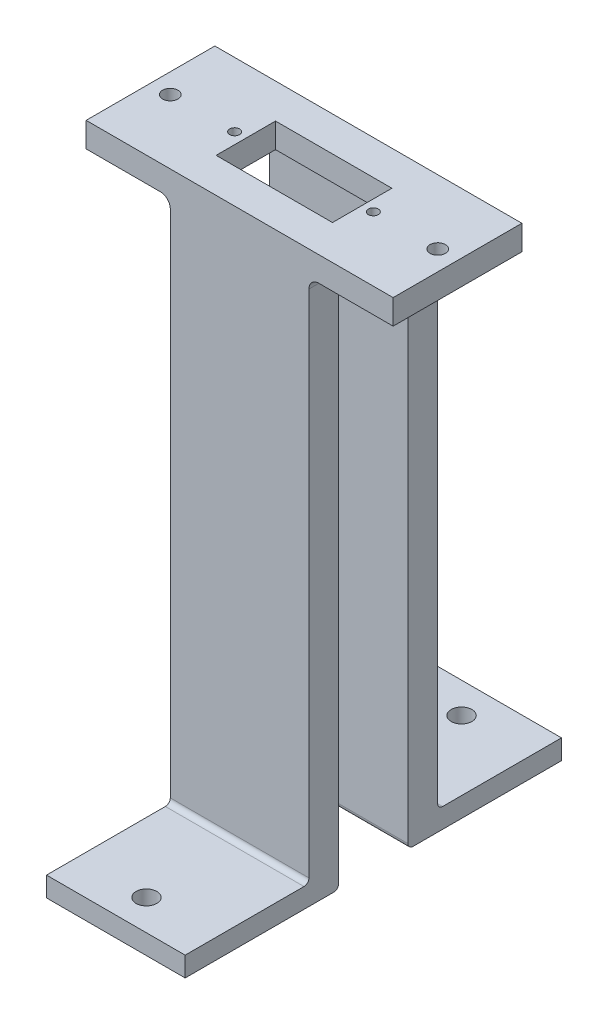
ISO-10303-21;
HEADER;
FILE_DESCRIPTION(('STEP AP214'),'2;1');
FILE_NAME('part.step','',(''),(''),'','','');
FILE_SCHEMA(('AUTOMOTIVE_DESIGN { 1 0 10303 214 1 1 1 1 }'));
ENDSEC;
DATA;
#1=APPLICATION_CONTEXT('core data for automotive mechanical design processes');
#2=APPLICATION_PROTOCOL_DEFINITION('international standard','automotive_design',2000,#1);
#3=PRODUCT_CONTEXT('',#1,'mechanical');
#4=PRODUCT('Part','Part','',(#3));
#5=PRODUCT_RELATED_PRODUCT_CATEGORY('part','',(#4));
#6=PRODUCT_DEFINITION_FORMATION('','',#4);
#7=PRODUCT_DEFINITION_CONTEXT('part definition',#1,'design');
#8=PRODUCT_DEFINITION('design','',#6,#7);
#9=PRODUCT_DEFINITION_SHAPE('','',#8);
#10=(LENGTH_UNIT() NAMED_UNIT(*) SI_UNIT(.MILLI.,.METRE.));
#11=(NAMED_UNIT(*) PLANE_ANGLE_UNIT() SI_UNIT($,.RADIAN.));
#12=(NAMED_UNIT(*) SI_UNIT($,.STERADIAN.) SOLID_ANGLE_UNIT());
#13=UNCERTAINTY_MEASURE_WITH_UNIT(LENGTH_MEASURE(1.E-05),#10,'distance_accuracy_value','');
#14=(GEOMETRIC_REPRESENTATION_CONTEXT(3) GLOBAL_UNCERTAINTY_ASSIGNED_CONTEXT((#13)) GLOBAL_UNIT_ASSIGNED_CONTEXT((#10,
#11,#12)) REPRESENTATION_CONTEXT('',''));
#15=CARTESIAN_POINT('',(0.,0.,0.));
#16=DIRECTION('',(0.,0.,1.));
#17=DIRECTION('',(1.,0.,0.));
#18=AXIS2_PLACEMENT_3D('',#15,#16,#17);
#19=CARTESIAN_POINT('',(-18.,0.,23.));
#20=DIRECTION('',(0.,1.,0.));
#21=DIRECTION('',(0.,0.,1.));
#22=AXIS2_PLACEMENT_3D('',#19,#20,#21);
#23=PLANE('',#22);
#24=CARTESIAN_POINT('',(-27.,0.,0.));
#25=DIRECTION('',(0.,-1.,0.));
#26=DIRECTION('',(0.,0.,-1.));
#27=AXIS2_PLACEMENT_3D('',#24,#25,#26);
#28=CIRCLE('',#27,1.55);
#29=CARTESIAN_POINT('',(-27.,0.,-1.55));
#30=VERTEX_POINT('',#29);
#31=EDGE_CURVE('E468',#30,#30,#28,.T.);
#32=ORIENTED_EDGE('',*,*,#31,.F.);
#33=EDGE_LOOP('',(#32));
#34=FACE_BOUND('',#33,.T.);
#35=CARTESIAN_POINT('',(27.,0.,0.));
#36=DIRECTION('',(0.,-1.,0.));
#37=DIRECTION('',(0.,0.,1.));
#38=AXIS2_PLACEMENT_3D('',#35,#36,#37);
#39=CIRCLE('',#38,1.55);
#40=CARTESIAN_POINT('',(27.,0.,1.55));
#41=VERTEX_POINT('',#40);
#42=EDGE_CURVE('E472',#41,#41,#39,.T.);
#43=ORIENTED_EDGE('',*,*,#42,.F.);
#44=EDGE_LOOP('',(#43));
#45=FACE_BOUND('',#44,.T.);
#46=DIRECTION('',(1.,0.,0.));
#47=VECTOR('',#46,1.);
#48=CARTESIAN_POINT('',(14.,0.,-7.));
#49=LINE('',#48,#47);
#50=CARTESIAN_POINT('',(-16.,0.,-7.));
#51=VERTEX_POINT('',#50);
#52=CARTESIAN_POINT('',(16.,0.,-7.));
#53=VERTEX_POINT('',#52);
#54=EDGE_CURVE('E248',#51,#53,#49,.T.);
#55=ORIENTED_EDGE('',*,*,#54,.T.);
#56=DIRECTION('',(0.,0.,1.));
#57=VECTOR('',#56,1.);
#58=CARTESIAN_POINT('',(16.,0.,23.));
#59=LINE('',#58,#57);
#60=CARTESIAN_POINT('',(16.,0.,-13.));
#61=VERTEX_POINT('',#60);
#62=EDGE_CURVE('E428',#53,#61,#59,.F.);
#63=ORIENTED_EDGE('',*,*,#62,.T.);
#64=DIRECTION('',(-1.,0.,0.));
#65=VECTOR('',#64,1.);
#66=CARTESIAN_POINT('',(-31.,0.,-12.9999999999999));
#67=LINE('',#66,#65);
#68=CARTESIAN_POINT('',(31.,0.,-13.));
#69=VERTEX_POINT('',#68);
#70=EDGE_CURVE('E464',#69,#61,#67,.T.);
#71=ORIENTED_EDGE('',*,*,#70,.F.);
#72=DIRECTION('',(0.,0.,-1.));
#73=VECTOR('',#72,1.);
#74=CARTESIAN_POINT('',(31.,0.,23.));
#75=LINE('',#74,#73);
#76=CARTESIAN_POINT('',(31.,0.,13.));
#77=VERTEX_POINT('',#76);
#78=EDGE_CURVE('E475',#77,#69,#75,.T.);
#79=ORIENTED_EDGE('',*,*,#78,.F.);
#80=DIRECTION('',(1.,0.,0.));
#81=VECTOR('',#80,1.);
#82=CARTESIAN_POINT('',(-31.,0.,13.));
#83=LINE('',#82,#81);
#84=CARTESIAN_POINT('',(16.,0.,13.));
#85=VERTEX_POINT('',#84);
#86=EDGE_CURVE('E455',#85,#77,#83,.T.);
#87=ORIENTED_EDGE('',*,*,#86,.F.);
#88=DIRECTION('',(0.,0.,1.));
#89=VECTOR('',#88,1.);
#90=CARTESIAN_POINT('',(16.,0.,7.));
#91=LINE('',#90,#89);
#92=CARTESIAN_POINT('',(16.,0.,7.));
#93=VERTEX_POINT('',#92);
#94=EDGE_CURVE('E422',#85,#93,#91,.F.);
#95=ORIENTED_EDGE('',*,*,#94,.T.);
#96=DIRECTION('',(-1.,0.,0.));
#97=VECTOR('',#96,1.);
#98=CARTESIAN_POINT('',(14.,0.,7.));
#99=LINE('',#98,#97);
#100=CARTESIAN_POINT('',(-16.,0.,7.));
#101=VERTEX_POINT('',#100);
#102=EDGE_CURVE('E250',#93,#101,#99,.T.);
#103=ORIENTED_EDGE('',*,*,#102,.T.);
#104=DIRECTION('',(0.,0.,-1.));
#105=VECTOR('',#104,1.);
#106=CARTESIAN_POINT('',(-16.,0.,13.));
#107=LINE('',#106,#105);
#108=CARTESIAN_POINT('',(-16.,0.,13.));
#109=VERTEX_POINT('',#108);
#110=EDGE_CURVE('E420',#101,#109,#107,.F.);
#111=ORIENTED_EDGE('',*,*,#110,.T.);
#112=CARTESIAN_POINT('',(-31.,0.,13.));
#113=VERTEX_POINT('',#112);
#114=EDGE_CURVE('E242',#113,#109,#83,.T.);
#115=ORIENTED_EDGE('',*,*,#114,.F.);
#116=DIRECTION('',(0.,0.,1.));
#117=VECTOR('',#116,1.);
#118=CARTESIAN_POINT('',(-31.,0.,-23.));
#119=LINE('',#118,#117);
#120=CARTESIAN_POINT('',(-31.,0.,-12.9999999999999));
#121=VERTEX_POINT('',#120);
#122=EDGE_CURVE('E241',#121,#113,#119,.T.);
#123=ORIENTED_EDGE('',*,*,#122,.F.);
#124=CARTESIAN_POINT('',(-16.,0.,-13.));
#125=VERTEX_POINT('',#124);
#126=EDGE_CURVE('E461',#125,#121,#67,.T.);
#127=ORIENTED_EDGE('',*,*,#126,.F.);
#128=DIRECTION('',(0.,0.,-1.));
#129=VECTOR('',#128,1.);
#130=CARTESIAN_POINT('',(-16.,0.,-6.99999999999999));
#131=LINE('',#130,#129);
#132=EDGE_CURVE('E425',#125,#51,#131,.F.);
#133=ORIENTED_EDGE('',*,*,#132,.T.);
#134=EDGE_LOOP('',(#55,#63,#71,#79,#87,#95,#103,#111,#115,#123,#127,#133));
#135=FACE_BOUND('',#134,.T.);
#136=CARTESIAN_POINT('',(-14.,0.,0.));
#137=DIRECTION('',(0.,1.,0.));
#138=DIRECTION('',(0.,0.,1.));
#139=AXIS2_PLACEMENT_3D('',#136,#137,#138);
#140=CIRCLE('',#139,1.);
#141=CARTESIAN_POINT('',(-14.,0.,1.));
#142=VERTEX_POINT('',#141);
#143=EDGE_CURVE('E260',#142,#142,#140,.F.);
#144=ORIENTED_EDGE('',*,*,#143,.F.);
#145=EDGE_LOOP('',(#144));
#146=FACE_BOUND('',#145,.T.);
#147=CARTESIAN_POINT('',(14.,0.,0.));
#148=DIRECTION('',(0.,1.,0.));
#149=DIRECTION('',(0.,0.,1.));
#150=AXIS2_PLACEMENT_3D('',#147,#148,#149);
#151=CIRCLE('',#150,1.);
#152=CARTESIAN_POINT('',(14.,0.,1.));
#153=VERTEX_POINT('',#152);
#154=EDGE_CURVE('E256',#153,#153,#151,.F.);
#155=ORIENTED_EDGE('',*,*,#154,.F.);
#156=EDGE_LOOP('',(#155));
#157=FACE_BOUND('',#156,.T.);
#158=DIRECTION('',(0.,0.,-1.));
#159=VECTOR('',#158,1.);
#160=CARTESIAN_POINT('',(-11.75,0.,6.));
#161=LINE('',#160,#159);
#162=CARTESIAN_POINT('',(-11.75,0.,6.));
#163=VERTEX_POINT('',#162);
#164=CARTESIAN_POINT('',(-11.75,0.,-6.));
#165=VERTEX_POINT('',#164);
#166=EDGE_CURVE('E259',#163,#165,#161,.T.);
#167=ORIENTED_EDGE('',*,*,#166,.F.);
#168=DIRECTION('',(-1.,0.,0.));
#169=VECTOR('',#168,1.);
#170=CARTESIAN_POINT('',(11.75,0.,6.));
#171=LINE('',#170,#169);
#172=CARTESIAN_POINT('',(11.75,0.,6.));
#173=VERTEX_POINT('',#172);
#174=EDGE_CURVE('E269',#173,#163,#171,.T.);
#175=ORIENTED_EDGE('',*,*,#174,.F.);
#176=DIRECTION('',(0.,0.,1.));
#177=VECTOR('',#176,1.);
#178=CARTESIAN_POINT('',(11.75,0.,-6.));
#179=LINE('',#178,#177);
#180=CARTESIAN_POINT('',(11.75,0.,-6.));
#181=VERTEX_POINT('',#180);
#182=EDGE_CURVE('E266',#181,#173,#179,.T.);
#183=ORIENTED_EDGE('',*,*,#182,.F.);
#184=DIRECTION('',(1.,0.,0.));
#185=VECTOR('',#184,1.);
#186=CARTESIAN_POINT('',(-11.75,0.,-6.));
#187=LINE('',#186,#185);
#188=EDGE_CURVE('E263',#165,#181,#187,.T.);
#189=ORIENTED_EDGE('',*,*,#188,.F.);
#190=EDGE_LOOP('',(#167,#175,#183,#189));
#191=FACE_BOUND('',#190,.T.);
#192=ADVANCED_FACE('F38',(#34,#45,#135,#146,#157,#191),#23,.F.);
#193=CARTESIAN_POINT('',(-18.,-110.,-7.));
#194=DIRECTION('',(0.,0.,-1.));
#195=DIRECTION('',(-1.,0.,0.));
#196=AXIS2_PLACEMENT_3D('',#193,#194,#195);
#197=PLANE('',#196);
#198=DIRECTION('',(-1.,0.,0.));
#199=VECTOR('',#198,1.);
#200=CARTESIAN_POINT('',(-18.,-109.,-7.));
#201=LINE('',#200,#199);
#202=CARTESIAN_POINT('',(-14.,-109.,-6.99999999999999));
#203=VERTEX_POINT('',#202);
#204=CARTESIAN_POINT('',(14.,-109.,-7.));
#205=VERTEX_POINT('',#204);
#206=EDGE_CURVE('E387',#203,#205,#201,.F.);
#207=ORIENTED_EDGE('',*,*,#206,.T.);
#208=DIRECTION('',(0.,-1.,0.));
#209=VECTOR('',#208,1.);
#210=CARTESIAN_POINT('',(14.,0.,-7.));
#211=LINE('',#210,#209);
#212=CARTESIAN_POINT('',(14.,-2.,-7.));
#213=VERTEX_POINT('',#212);
#214=EDGE_CURVE('E308',#213,#205,#211,.T.);
#215=ORIENTED_EDGE('',*,*,#214,.F.);
#216=CARTESIAN_POINT('',(16.,-2.,-7.));
#217=DIRECTION('',(0.,0.,-1.));
#218=DIRECTION('',(-1.,0.,0.));
#219=AXIS2_PLACEMENT_3D('',#216,#217,#218);
#220=CIRCLE('',#219,2.);
#221=EDGE_CURVE('E438',#213,#53,#220,.T.);
#222=ORIENTED_EDGE('',*,*,#221,.T.);
#223=ORIENTED_EDGE('',*,*,#54,.F.);
#224=CARTESIAN_POINT('',(-16.,-2.,-7.));
#225=DIRECTION('',(0.,0.,-1.));
#226=DIRECTION('',(-1.,0.,0.));
#227=AXIS2_PLACEMENT_3D('',#224,#225,#226);
#228=CIRCLE('',#227,2.);
#229=CARTESIAN_POINT('',(-14.,-2.,-6.99999999999999));
#230=VERTEX_POINT('',#229);
#231=EDGE_CURVE('E445',#51,#230,#228,.T.);
#232=ORIENTED_EDGE('',*,*,#231,.T.);
#233=DIRECTION('',(0.,1.,0.));
#234=VECTOR('',#233,1.);
#235=CARTESIAN_POINT('',(-14.,0.,-6.99999999999999));
#236=LINE('',#235,#234);
#237=EDGE_CURVE('E294',#203,#230,#236,.T.);
#238=ORIENTED_EDGE('',*,*,#237,.F.);
#239=EDGE_LOOP('',(#207,#215,#222,#223,#232,#238));
#240=FACE_BOUND('',#239,.T.);
#241=ADVANCED_FACE('F516',(#240),#197,.F.);
#242=CARTESIAN_POINT('',(0.,-110.,0.));
#243=DIRECTION('',(0.,1.,0.));
#244=DIRECTION('',(0.,0.,1.));
#245=AXIS2_PLACEMENT_3D('',#242,#243,#244);
#246=PLANE('',#245);
#247=CARTESIAN_POINT('',(0.,-110.,-31.819805155));
#248=DIRECTION('',(0.,-1.,0.));
#249=DIRECTION('',(0.,0.,1.));
#250=AXIS2_PLACEMENT_3D('',#247,#248,#249);
#251=CIRCLE('',#250,2.1);
#252=CARTESIAN_POINT('',(0.,-110.,-29.719805155));
#253=VERTEX_POINT('',#252);
#254=EDGE_CURVE('E363',#253,#253,#251,.T.);
#255=ORIENTED_EDGE('',*,*,#254,.F.);
#256=EDGE_LOOP('',(#255));
#257=FACE_BOUND('',#256,.T.);
#258=DIRECTION('',(0.,0.,-1.));
#259=VECTOR('',#258,1.);
#260=CARTESIAN_POINT('',(14.,-110.,-7.));
#261=LINE('',#260,#259);
#262=CARTESIAN_POINT('',(14.,-110.,-7.99999999999999));
#263=VERTEX_POINT('',#262);
#264=CARTESIAN_POINT('',(14.,-110.,-38.));
#265=VERTEX_POINT('',#264);
#266=EDGE_CURVE('E323',#263,#265,#261,.T.);
#267=ORIENTED_EDGE('',*,*,#266,.F.);
#268=DIRECTION('',(-1.,0.,0.));
#269=VECTOR('',#268,1.);
#270=CARTESIAN_POINT('',(0.,-110.,-8.));
#271=LINE('',#270,#269);
#272=CARTESIAN_POINT('',(-14.,-110.,-8.));
#273=VERTEX_POINT('',#272);
#274=EDGE_CURVE('E382',#263,#273,#271,.T.);
#275=ORIENTED_EDGE('',*,*,#274,.T.);
#276=DIRECTION('',(0.,0.,1.));
#277=VECTOR('',#276,1.);
#278=CARTESIAN_POINT('',(-14.,-110.,-6.99999999999999));
#279=LINE('',#278,#277);
#280=CARTESIAN_POINT('',(-14.,-110.,-38.));
#281=VERTEX_POINT('',#280);
#282=EDGE_CURVE('E291',#281,#273,#279,.T.);
#283=ORIENTED_EDGE('',*,*,#282,.F.);
#284=DIRECTION('',(-1.,0.,0.));
#285=VECTOR('',#284,1.);
#286=CARTESIAN_POINT('',(18.,-110.,-38.));
#287=LINE('',#286,#285);
#288=EDGE_CURVE('E359',#265,#281,#287,.T.);
#289=ORIENTED_EDGE('',*,*,#288,.F.);
#290=EDGE_LOOP('',(#267,#275,#283,#289));
#291=FACE_BOUND('',#290,.T.);
#292=ADVANCED_FACE('F525',(#257,#291),#246,.F.);
#293=CARTESIAN_POINT('',(0.,-106.,0.));
#294=DIRECTION('',(0.,-1.,0.));
#295=DIRECTION('',(0.,0.,-1.));
#296=AXIS2_PLACEMENT_3D('',#293,#294,#295);
#297=PLANE('',#296);
#298=CARTESIAN_POINT('',(0.,-106.,-31.819805155));
#299=DIRECTION('',(0.,-1.,0.));
#300=DIRECTION('',(0.,0.,-1.));
#301=AXIS2_PLACEMENT_3D('',#298,#299,#300);
#302=CIRCLE('',#301,2.1);
#303=CARTESIAN_POINT('',(0.,-106.,-33.919805155));
#304=VERTEX_POINT('',#303);
#305=EDGE_CURVE('E329',#304,#304,#302,.F.);
#306=ORIENTED_EDGE('',*,*,#305,.F.);
#307=EDGE_LOOP('',(#306));
#308=FACE_BOUND('',#307,.T.);
#309=DIRECTION('',(0.,0.,-1.));
#310=VECTOR('',#309,1.);
#311=CARTESIAN_POINT('',(-14.,-106.,-38.));
#312=LINE('',#311,#310);
#313=CARTESIAN_POINT('',(-14.,-106.,-14.));
#314=VERTEX_POINT('',#313);
#315=CARTESIAN_POINT('',(-14.,-106.,-38.));
#316=VERTEX_POINT('',#315);
#317=EDGE_CURVE('E286',#314,#316,#312,.T.);
#318=ORIENTED_EDGE('',*,*,#317,.F.);
#319=DIRECTION('',(-1.,0.,0.));
#320=VECTOR('',#319,1.);
#321=CARTESIAN_POINT('',(0.,-106.,-14.));
#322=LINE('',#321,#320);
#323=CARTESIAN_POINT('',(14.,-106.,-14.));
#324=VERTEX_POINT('',#323);
#325=EDGE_CURVE('E380',#314,#324,#322,.F.);
#326=ORIENTED_EDGE('',*,*,#325,.T.);
#327=DIRECTION('',(0.,0.,1.));
#328=VECTOR('',#327,1.);
#329=CARTESIAN_POINT('',(14.,-106.,-38.));
#330=LINE('',#329,#328);
#331=CARTESIAN_POINT('',(14.,-106.,-38.));
#332=VERTEX_POINT('',#331);
#333=EDGE_CURVE('E297',#332,#324,#330,.T.);
#334=ORIENTED_EDGE('',*,*,#333,.F.);
#335=DIRECTION('',(1.,0.,0.));
#336=VECTOR('',#335,1.);
#337=CARTESIAN_POINT('',(-18.,-106.,-38.));
#338=LINE('',#337,#336);
#339=EDGE_CURVE('E370',#316,#332,#338,.T.);
#340=ORIENTED_EDGE('',*,*,#339,.F.);
#341=EDGE_LOOP('',(#318,#326,#334,#340));
#342=FACE_BOUND('',#341,.T.);
#343=ADVANCED_FACE('F533',(#308,#342),#297,.F.);
#344=CARTESIAN_POINT('',(0.,0.,-38.));
#345=DIRECTION('',(0.,0.,-1.));
#346=DIRECTION('',(-1.,0.,0.));
#347=AXIS2_PLACEMENT_3D('',#344,#345,#346);
#348=PLANE('',#347);
#349=DIRECTION('',(0.,-1.,0.));
#350=VECTOR('',#349,1.);
#351=CARTESIAN_POINT('',(-14.,-110.,-38.));
#352=LINE('',#351,#350);
#353=EDGE_CURVE('E288',#316,#281,#352,.T.);
#354=ORIENTED_EDGE('',*,*,#353,.F.);
#355=ORIENTED_EDGE('',*,*,#339,.T.);
#356=DIRECTION('',(0.,1.,0.));
#357=VECTOR('',#356,1.);
#358=CARTESIAN_POINT('',(14.,-110.,-38.));
#359=LINE('',#358,#357);
#360=EDGE_CURVE('E320',#265,#332,#359,.T.);
#361=ORIENTED_EDGE('',*,*,#360,.F.);
#362=ORIENTED_EDGE('',*,*,#288,.T.);
#363=EDGE_LOOP('',(#354,#355,#361,#362));
#364=FACE_BOUND('',#363,.T.);
#365=ADVANCED_FACE('F530',(#364),#348,.T.);
#366=CARTESIAN_POINT('',(0.,5.,0.));
#367=DIRECTION('',(0.,1.,0.));
#368=DIRECTION('',(0.,0.,1.));
#369=AXIS2_PLACEMENT_3D('',#366,#367,#368);
#370=PLANE('',#369);
#371=DIRECTION('',(1.,0.,0.));
#372=VECTOR('',#371,1.);
#373=CARTESIAN_POINT('',(-31.,5.,13.));
#374=LINE('',#373,#372);
#375=CARTESIAN_POINT('',(-31.,5.,13.));
#376=VERTEX_POINT('',#375);
#377=CARTESIAN_POINT('',(31.,5.,13.));
#378=VERTEX_POINT('',#377);
#379=EDGE_CURVE('E221',#376,#378,#374,.T.);
#380=ORIENTED_EDGE('',*,*,#379,.T.);
#381=DIRECTION('',(0.,0.,1.));
#382=VECTOR('',#381,1.);
#383=CARTESIAN_POINT('',(31.,5.,-23.));
#384=LINE('',#383,#382);
#385=CARTESIAN_POINT('',(31.,5.,-12.9999999999999));
#386=VERTEX_POINT('',#385);
#387=EDGE_CURVE('E252',#386,#378,#384,.T.);
#388=ORIENTED_EDGE('',*,*,#387,.F.);
#389=DIRECTION('',(-1.,0.,0.));
#390=VECTOR('',#389,1.);
#391=CARTESIAN_POINT('',(-31.,5.,-12.9999999999999));
#392=LINE('',#391,#390);
#393=CARTESIAN_POINT('',(-31.,5.,-12.9999999999999));
#394=VERTEX_POINT('',#393);
#395=EDGE_CURVE('E247',#386,#394,#392,.T.);
#396=ORIENTED_EDGE('',*,*,#395,.T.);
#397=DIRECTION('',(0.,0.,-1.));
#398=VECTOR('',#397,1.);
#399=CARTESIAN_POINT('',(-31.,5.,23.));
#400=LINE('',#399,#398);
#401=EDGE_CURVE('E239',#376,#394,#400,.T.);
#402=ORIENTED_EDGE('',*,*,#401,.F.);
#403=EDGE_LOOP('',(#380,#388,#396,#402));
#404=FACE_BOUND('',#403,.T.);
#405=CARTESIAN_POINT('',(-27.,5.,0.));
#406=DIRECTION('',(0.,1.,0.));
#407=DIRECTION('',(0.,0.,1.));
#408=AXIS2_PLACEMENT_3D('',#405,#406,#407);
#409=CIRCLE('',#408,1.55);
#410=CARTESIAN_POINT('',(-27.,5.,1.55));
#411=VERTEX_POINT('',#410);
#412=EDGE_CURVE('E471',#411,#411,#409,.F.);
#413=ORIENTED_EDGE('',*,*,#412,.T.);
#414=EDGE_LOOP('',(#413));
#415=FACE_BOUND('',#414,.T.);
#416=CARTESIAN_POINT('',(27.,5.,0.));
#417=DIRECTION('',(0.,1.,0.));
#418=DIRECTION('',(0.,0.,1.));
#419=AXIS2_PLACEMENT_3D('',#416,#417,#418);
#420=CIRCLE('',#419,1.55);
#421=CARTESIAN_POINT('',(27.,5.,1.55));
#422=VERTEX_POINT('',#421);
#423=EDGE_CURVE('E232',#422,#422,#420,.F.);
#424=ORIENTED_EDGE('',*,*,#423,.T.);
#425=EDGE_LOOP('',(#424));
#426=FACE_BOUND('',#425,.T.);
#427=CARTESIAN_POINT('',(14.,5.,0.));
#428=DIRECTION('',(0.,1.,0.));
#429=DIRECTION('',(0.,0.,1.));
#430=AXIS2_PLACEMENT_3D('',#427,#428,#429);
#431=CIRCLE('',#430,1.);
#432=CARTESIAN_POINT('',(14.,5.,1.));
#433=VERTEX_POINT('',#432);
#434=EDGE_CURVE('E326',#433,#433,#431,.F.);
#435=ORIENTED_EDGE('',*,*,#434,.T.);
#436=EDGE_LOOP('',(#435));
#437=FACE_BOUND('',#436,.T.);
#438=CARTESIAN_POINT('',(-14.,5.,0.));
#439=DIRECTION('',(0.,1.,0.));
#440=DIRECTION('',(0.,0.,1.));
#441=AXIS2_PLACEMENT_3D('',#438,#439,#440);
#442=CIRCLE('',#441,1.);
#443=CARTESIAN_POINT('',(-14.,5.,1.));
#444=VERTEX_POINT('',#443);
#445=EDGE_CURVE('E330',#444,#444,#442,.F.);
#446=ORIENTED_EDGE('',*,*,#445,.T.);
#447=EDGE_LOOP('',(#446));
#448=FACE_BOUND('',#447,.T.);
#449=DIRECTION('',(0.,0.,1.));
#450=VECTOR('',#449,1.);
#451=CARTESIAN_POINT('',(11.75,5.,6.));
#452=LINE('',#451,#450);
#453=CARTESIAN_POINT('',(11.75,5.,-6.));
#454=VERTEX_POINT('',#453);
#455=CARTESIAN_POINT('',(11.75,5.,6.));
#456=VERTEX_POINT('',#455);
#457=EDGE_CURVE('E340',#454,#456,#452,.T.);
#458=ORIENTED_EDGE('',*,*,#457,.T.);
#459=DIRECTION('',(-1.,0.,0.));
#460=VECTOR('',#459,1.);
#461=CARTESIAN_POINT('',(-11.75,5.,6.));
#462=LINE('',#461,#460);
#463=CARTESIAN_POINT('',(-11.75,5.,6.));
#464=VERTEX_POINT('',#463);
#465=EDGE_CURVE('E317',#456,#464,#462,.T.);
#466=ORIENTED_EDGE('',*,*,#465,.T.);
#467=DIRECTION('',(0.,0.,-1.));
#468=VECTOR('',#467,1.);
#469=CARTESIAN_POINT('',(-11.75,5.,6.));
#470=LINE('',#469,#468);
#471=CARTESIAN_POINT('',(-11.75,5.,-6.));
#472=VERTEX_POINT('',#471);
#473=EDGE_CURVE('E333',#464,#472,#470,.T.);
#474=ORIENTED_EDGE('',*,*,#473,.T.);
#475=DIRECTION('',(1.,0.,0.));
#476=VECTOR('',#475,1.);
#477=CARTESIAN_POINT('',(-11.75,5.,-6.));
#478=LINE('',#477,#476);
#479=EDGE_CURVE('E351',#472,#454,#478,.T.);
#480=ORIENTED_EDGE('',*,*,#479,.T.);
#481=EDGE_LOOP('',(#458,#466,#474,#480));
#482=FACE_BOUND('',#481,.T.);
#483=ADVANCED_FACE('F245',(#404,#415,#426,#437,#448,#482),#370,.T.);
#484=CARTESIAN_POINT('',(-18.,-110.,7.));
#485=DIRECTION('',(0.,0.,1.));
#486=DIRECTION('',(1.,0.,0.));
#487=AXIS2_PLACEMENT_3D('',#484,#485,#486);
#488=PLANE('',#487);
#489=DIRECTION('',(0.,-1.,0.));
#490=VECTOR('',#489,1.);
#491=CARTESIAN_POINT('',(-14.,-110.,7.));
#492=LINE('',#491,#490);
#493=CARTESIAN_POINT('',(-14.,-2.,7.));
#494=VERTEX_POINT('',#493);
#495=CARTESIAN_POINT('',(-14.,-109.,7.));
#496=VERTEX_POINT('',#495);
#497=EDGE_CURVE('E289',#494,#496,#492,.T.);
#498=ORIENTED_EDGE('',*,*,#497,.F.);
#499=CARTESIAN_POINT('',(-16.,-2.,7.));
#500=DIRECTION('',(0.,0.,1.));
#501=DIRECTION('',(1.,0.,0.));
#502=AXIS2_PLACEMENT_3D('',#499,#500,#501);
#503=CIRCLE('',#502,2.);
#504=EDGE_CURVE('E46',#494,#101,#503,.T.);
#505=ORIENTED_EDGE('',*,*,#504,.T.);
#506=ORIENTED_EDGE('',*,*,#102,.F.);
#507=CARTESIAN_POINT('',(16.,-2.,7.));
#508=DIRECTION('',(0.,0.,1.));
#509=DIRECTION('',(1.,0.,0.));
#510=AXIS2_PLACEMENT_3D('',#507,#508,#509);
#511=CIRCLE('',#510,2.);
#512=CARTESIAN_POINT('',(14.,-2.,7.));
#513=VERTEX_POINT('',#512);
#514=EDGE_CURVE('E449',#93,#513,#511,.T.);
#515=ORIENTED_EDGE('',*,*,#514,.T.);
#516=DIRECTION('',(0.,1.,0.));
#517=VECTOR('',#516,1.);
#518=CARTESIAN_POINT('',(14.,-110.,7.));
#519=LINE('',#518,#517);
#520=CARTESIAN_POINT('',(14.,-109.,7.));
#521=VERTEX_POINT('',#520);
#522=EDGE_CURVE('E314',#521,#513,#519,.T.);
#523=ORIENTED_EDGE('',*,*,#522,.F.);
#524=DIRECTION('',(1.,0.,0.));
#525=VECTOR('',#524,1.);
#526=CARTESIAN_POINT('',(-14.,-109.,7.));
#527=LINE('',#526,#525);
#528=EDGE_CURVE('E397',#521,#496,#527,.F.);
#529=ORIENTED_EDGE('',*,*,#528,.T.);
#530=EDGE_LOOP('',(#498,#505,#506,#515,#523,#529));
#531=FACE_BOUND('',#530,.T.);
#532=ADVANCED_FACE('F452',(#531),#488,.F.);
#533=CARTESIAN_POINT('',(0.,-110.,0.));
#534=DIRECTION('',(0.,-1.,0.));
#535=DIRECTION('',(0.,0.,-1.));
#536=AXIS2_PLACEMENT_3D('',#533,#534,#535);
#537=PLANE('',#536);
#538=DIRECTION('',(0.,0.,1.));
#539=VECTOR('',#538,1.);
#540=CARTESIAN_POINT('',(-14.,-110.,38.));
#541=LINE('',#540,#539);
#542=CARTESIAN_POINT('',(-14.,-110.,8.));
#543=VERTEX_POINT('',#542);
#544=CARTESIAN_POINT('',(-14.,-110.,38.));
#545=VERTEX_POINT('',#544);
#546=EDGE_CURVE('E302',#543,#545,#541,.T.);
#547=ORIENTED_EDGE('',*,*,#546,.F.);
#548=DIRECTION('',(1.,0.,0.));
#549=VECTOR('',#548,1.);
#550=CARTESIAN_POINT('',(14.,-110.,8.));
#551=LINE('',#550,#549);
#552=CARTESIAN_POINT('',(14.,-110.,8.));
#553=VERTEX_POINT('',#552);
#554=EDGE_CURVE('E392',#543,#553,#551,.T.);
#555=ORIENTED_EDGE('',*,*,#554,.T.);
#556=DIRECTION('',(0.,0.,-1.));
#557=VECTOR('',#556,1.);
#558=CARTESIAN_POINT('',(14.,-110.,38.));
#559=LINE('',#558,#557);
#560=CARTESIAN_POINT('',(14.,-110.,38.));
#561=VERTEX_POINT('',#560);
#562=EDGE_CURVE('E311',#561,#553,#559,.T.);
#563=ORIENTED_EDGE('',*,*,#562,.F.);
#564=DIRECTION('',(1.,0.,0.));
#565=VECTOR('',#564,1.);
#566=CARTESIAN_POINT('',(-18.,-110.,38.));
#567=LINE('',#566,#565);
#568=EDGE_CURVE('E372',#545,#561,#567,.T.);
#569=ORIENTED_EDGE('',*,*,#568,.F.);
#570=EDGE_LOOP('',(#547,#555,#563,#569));
#571=FACE_BOUND('',#570,.T.);
#572=CARTESIAN_POINT('',(0.,-110.,31.819805155));
#573=DIRECTION('',(0.,-1.,0.));
#574=DIRECTION('',(0.,0.,-1.));
#575=AXIS2_PLACEMENT_3D('',#572,#573,#574);
#576=CIRCLE('',#575,2.1);
#577=CARTESIAN_POINT('',(0.,-110.,29.719805155));
#578=VERTEX_POINT('',#577);
#579=EDGE_CURVE('E356',#578,#578,#576,.T.);
#580=ORIENTED_EDGE('',*,*,#579,.F.);
#581=EDGE_LOOP('',(#580));
#582=FACE_BOUND('',#581,.T.);
#583=ADVANCED_FACE('F647',(#571,#582),#537,.T.);
#584=CARTESIAN_POINT('',(0.,-106.,0.));
#585=DIRECTION('',(0.,1.,0.));
#586=DIRECTION('',(0.,0.,1.));
#587=AXIS2_PLACEMENT_3D('',#584,#585,#586);
#588=PLANE('',#587);
#589=DIRECTION('',(0.,0.,1.));
#590=VECTOR('',#589,1.);
#591=CARTESIAN_POINT('',(14.,-106.,15.));
#592=LINE('',#591,#590);
#593=CARTESIAN_POINT('',(14.,-106.,14.));
#594=VERTEX_POINT('',#593);
#595=CARTESIAN_POINT('',(14.,-106.,38.));
#596=VERTEX_POINT('',#595);
#597=EDGE_CURVE('E305',#594,#596,#592,.T.);
#598=ORIENTED_EDGE('',*,*,#597,.F.);
#599=DIRECTION('',(1.,0.,0.));
#600=VECTOR('',#599,1.);
#601=CARTESIAN_POINT('',(-14.,-106.,14.));
#602=LINE('',#601,#600);
#603=CARTESIAN_POINT('',(-14.,-106.,14.));
#604=VERTEX_POINT('',#603);
#605=EDGE_CURVE('E405',#594,#604,#602,.F.);
#606=ORIENTED_EDGE('',*,*,#605,.T.);
#607=DIRECTION('',(0.,0.,-1.));
#608=VECTOR('',#607,1.);
#609=CARTESIAN_POINT('',(-14.,-106.,15.));
#610=LINE('',#609,#608);
#611=CARTESIAN_POINT('',(-14.,-106.,38.));
#612=VERTEX_POINT('',#611);
#613=EDGE_CURVE('E285',#612,#604,#610,.T.);
#614=ORIENTED_EDGE('',*,*,#613,.F.);
#615=DIRECTION('',(-1.,0.,0.));
#616=VECTOR('',#615,1.);
#617=CARTESIAN_POINT('',(18.,-106.,38.));
#618=LINE('',#617,#616);
#619=EDGE_CURVE('E374',#596,#612,#618,.T.);
#620=ORIENTED_EDGE('',*,*,#619,.F.);
#621=EDGE_LOOP('',(#598,#606,#614,#620));
#622=FACE_BOUND('',#621,.T.);
#623=CARTESIAN_POINT('',(0.,-106.,31.819805155));
#624=DIRECTION('',(0.,1.,0.));
#625=DIRECTION('',(0.,0.,1.));
#626=AXIS2_PLACEMENT_3D('',#623,#624,#625);
#627=CIRCLE('',#626,2.1);
#628=CARTESIAN_POINT('',(0.,-106.,33.919805155));
#629=VERTEX_POINT('',#628);
#630=EDGE_CURVE('E360',#629,#629,#627,.F.);
#631=ORIENTED_EDGE('',*,*,#630,.T.);
#632=EDGE_LOOP('',(#631));
#633=FACE_BOUND('',#632,.T.);
#634=ADVANCED_FACE('F559',(#622,#633),#588,.T.);
#635=CARTESIAN_POINT('',(0.,0.,38.));
#636=DIRECTION('',(0.,0.,1.));
#637=DIRECTION('',(1.,0.,0.));
#638=AXIS2_PLACEMENT_3D('',#635,#636,#637);
#639=PLANE('',#638);
#640=DIRECTION('',(0.,1.,0.));
#641=VECTOR('',#640,1.);
#642=CARTESIAN_POINT('',(-14.,-106.,38.));
#643=LINE('',#642,#641);
#644=EDGE_CURVE('E300',#545,#612,#643,.T.);
#645=ORIENTED_EDGE('',*,*,#644,.F.);
#646=ORIENTED_EDGE('',*,*,#568,.T.);
#647=DIRECTION('',(0.,-1.,0.));
#648=VECTOR('',#647,1.);
#649=CARTESIAN_POINT('',(14.,-106.,38.));
#650=LINE('',#649,#648);
#651=EDGE_CURVE('E307',#596,#561,#650,.T.);
#652=ORIENTED_EDGE('',*,*,#651,.F.);
#653=ORIENTED_EDGE('',*,*,#619,.T.);
#654=EDGE_LOOP('',(#645,#646,#652,#653));
#655=FACE_BOUND('',#654,.T.);
#656=ADVANCED_FACE('F556',(#655),#639,.T.);
#657=CARTESIAN_POINT('',(0.,5.00100000000001,-31.819805155));
#658=DIRECTION('',(0.,-1.,0.));
#659=DIRECTION('',(0.,0.,-1.));
#660=AXIS2_PLACEMENT_3D('',#657,#658,#659);
#661=CYLINDRICAL_SURFACE('',#660,2.1);
#662=ORIENTED_EDGE('',*,*,#254,.T.);
#663=EDGE_LOOP('',(#662));
#664=FACE_BOUND('',#663,.T.);
#665=ORIENTED_EDGE('',*,*,#305,.T.);
#666=EDGE_LOOP('',(#665));
#667=FACE_BOUND('',#666,.T.);
#668=ADVANCED_FACE('F558',(#664,#667),#661,.F.);
#669=CARTESIAN_POINT('',(0.,5.00100000000001,31.819805155));
#670=DIRECTION('',(0.,-1.,0.));
#671=DIRECTION('',(0.,0.,-1.));
#672=AXIS2_PLACEMENT_3D('',#669,#670,#671);
#673=CYLINDRICAL_SURFACE('',#672,2.1);
#674=ORIENTED_EDGE('',*,*,#630,.F.);
#675=EDGE_LOOP('',(#674));
#676=FACE_BOUND('',#675,.T.);
#677=ORIENTED_EDGE('',*,*,#579,.T.);
#678=EDGE_LOOP('',(#677));
#679=FACE_BOUND('',#678,.T.);
#680=ADVANCED_FACE('F564',(#676,#679),#673,.F.);
#681=CARTESIAN_POINT('',(11.75,5.001,6.));
#682=DIRECTION('',(1.,0.,0.));
#683=DIRECTION('',(0.,0.,-1.));
#684=AXIS2_PLACEMENT_3D('',#681,#682,#683);
#685=PLANE('',#684);
#686=DIRECTION('',(0.,-1.,0.));
#687=VECTOR('',#686,1.);
#688=CARTESIAN_POINT('',(11.75,5.001,-6.));
#689=LINE('',#688,#687);
#690=EDGE_CURVE('E336',#454,#181,#689,.T.);
#691=ORIENTED_EDGE('',*,*,#690,.T.);
#692=ORIENTED_EDGE('',*,*,#182,.T.);
#693=DIRECTION('',(0.,-1.,0.));
#694=VECTOR('',#693,1.);
#695=CARTESIAN_POINT('',(11.75,5.001,6.));
#696=LINE('',#695,#694);
#697=EDGE_CURVE('E337',#456,#173,#696,.T.);
#698=ORIENTED_EDGE('',*,*,#697,.F.);
#699=ORIENTED_EDGE('',*,*,#457,.F.);
#700=EDGE_LOOP('',(#691,#692,#698,#699));
#701=FACE_BOUND('',#700,.T.);
#702=ADVANCED_FACE('F568',(#701),#685,.F.);
#703=CARTESIAN_POINT('',(-11.75,5.001,-6.));
#704=DIRECTION('',(0.,0.,-1.));
#705=DIRECTION('',(-1.,0.,0.));
#706=AXIS2_PLACEMENT_3D('',#703,#704,#705);
#707=PLANE('',#706);
#708=DIRECTION('',(0.,-1.,0.));
#709=VECTOR('',#708,1.);
#710=CARTESIAN_POINT('',(-11.75,5.001,-6.));
#711=LINE('',#710,#709);
#712=EDGE_CURVE('E344',#472,#165,#711,.T.);
#713=ORIENTED_EDGE('',*,*,#712,.T.);
#714=ORIENTED_EDGE('',*,*,#188,.T.);
#715=ORIENTED_EDGE('',*,*,#690,.F.);
#716=ORIENTED_EDGE('',*,*,#479,.F.);
#717=EDGE_LOOP('',(#713,#714,#715,#716));
#718=FACE_BOUND('',#717,.T.);
#719=ADVANCED_FACE('F570',(#718),#707,.F.);
#720=CARTESIAN_POINT('',(-11.75,5.001,6.));
#721=DIRECTION('',(-1.,0.,0.));
#722=DIRECTION('',(0.,0.,1.));
#723=AXIS2_PLACEMENT_3D('',#720,#721,#722);
#724=PLANE('',#723);
#725=DIRECTION('',(0.,-1.,0.));
#726=VECTOR('',#725,1.);
#727=CARTESIAN_POINT('',(-11.75,5.001,6.));
#728=LINE('',#727,#726);
#729=EDGE_CURVE('E341',#464,#163,#728,.T.);
#730=ORIENTED_EDGE('',*,*,#729,.T.);
#731=ORIENTED_EDGE('',*,*,#166,.T.);
#732=ORIENTED_EDGE('',*,*,#712,.F.);
#733=ORIENTED_EDGE('',*,*,#473,.F.);
#734=EDGE_LOOP('',(#730,#731,#732,#733));
#735=FACE_BOUND('',#734,.T.);
#736=ADVANCED_FACE('F573',(#735),#724,.F.);
#737=CARTESIAN_POINT('',(-11.75,5.001,6.));
#738=DIRECTION('',(0.,0.,1.));
#739=DIRECTION('',(1.,0.,0.));
#740=AXIS2_PLACEMENT_3D('',#737,#738,#739);
#741=PLANE('',#740);
#742=ORIENTED_EDGE('',*,*,#697,.T.);
#743=ORIENTED_EDGE('',*,*,#174,.T.);
#744=ORIENTED_EDGE('',*,*,#729,.F.);
#745=ORIENTED_EDGE('',*,*,#465,.F.);
#746=EDGE_LOOP('',(#742,#743,#744,#745));
#747=FACE_BOUND('',#746,.T.);
#748=ADVANCED_FACE('F577',(#747),#741,.F.);
#749=CARTESIAN_POINT('',(-14.,5.001,0.));
#750=DIRECTION('',(0.,-1.,0.));
#751=DIRECTION('',(0.,0.,-1.));
#752=AXIS2_PLACEMENT_3D('',#749,#750,#751);
#753=CYLINDRICAL_SURFACE('',#752,1.);
#754=ORIENTED_EDGE('',*,*,#143,.T.);
#755=EDGE_LOOP('',(#754));
#756=FACE_BOUND('',#755,.T.);
#757=ORIENTED_EDGE('',*,*,#445,.F.);
#758=EDGE_LOOP('',(#757));
#759=FACE_BOUND('',#758,.T.);
#760=ADVANCED_FACE('F581',(#756,#759),#753,.F.);
#761=CARTESIAN_POINT('',(14.,5.001,0.));
#762=DIRECTION('',(0.,-1.,0.));
#763=DIRECTION('',(0.,0.,-1.));
#764=AXIS2_PLACEMENT_3D('',#761,#762,#763);
#765=CYLINDRICAL_SURFACE('',#764,1.);
#766=ORIENTED_EDGE('',*,*,#154,.T.);
#767=EDGE_LOOP('',(#766));
#768=FACE_BOUND('',#767,.T.);
#769=ORIENTED_EDGE('',*,*,#434,.F.);
#770=EDGE_LOOP('',(#769));
#771=FACE_BOUND('',#770,.T.);
#772=ADVANCED_FACE('F588',(#768,#771),#765,.F.);
#773=CARTESIAN_POINT('',(14.,0.,0.));
#774=DIRECTION('',(1.,0.,0.));
#775=DIRECTION('',(0.,0.,-1.));
#776=AXIS2_PLACEMENT_3D('',#773,#774,#775);
#777=PLANE('',#776);
#778=DIRECTION('',(0.,-1.,0.));
#779=VECTOR('',#778,1.);
#780=CARTESIAN_POINT('',(14.,0.,-13.));
#781=LINE('',#780,#779);
#782=CARTESIAN_POINT('',(14.,-2.,-13.));
#783=VERTEX_POINT('',#782);
#784=CARTESIAN_POINT('',(14.,-105.,-13.));
#785=VERTEX_POINT('',#784);
#786=EDGE_CURVE('E271',#783,#785,#781,.T.);
#787=ORIENTED_EDGE('',*,*,#786,.F.);
#788=DIRECTION('',(0.,0.,1.));
#789=VECTOR('',#788,1.);
#790=CARTESIAN_POINT('',(14.,-2.,0.));
#791=LINE('',#790,#789);
#792=EDGE_CURVE('E417',#783,#213,#791,.T.);
#793=ORIENTED_EDGE('',*,*,#792,.T.);
#794=ORIENTED_EDGE('',*,*,#214,.T.);
#795=CARTESIAN_POINT('',(14.,-109.,-7.99999999999999));
#796=DIRECTION('',(1.,0.,0.));
#797=DIRECTION('',(0.,0.,-1.));
#798=AXIS2_PLACEMENT_3D('',#795,#796,#797);
#799=CIRCLE('',#798,1.);
#800=EDGE_CURVE('E390',#205,#263,#799,.T.);
#801=ORIENTED_EDGE('',*,*,#800,.T.);
#802=ORIENTED_EDGE('',*,*,#266,.T.);
#803=ORIENTED_EDGE('',*,*,#360,.T.);
#804=ORIENTED_EDGE('',*,*,#333,.T.);
#805=CARTESIAN_POINT('',(14.,-105.,-14.));
#806=DIRECTION('',(1.,0.,0.));
#807=DIRECTION('',(0.,0.,-1.));
#808=AXIS2_PLACEMENT_3D('',#805,#806,#807);
#809=CIRCLE('',#808,1.);
#810=EDGE_CURVE('E409',#324,#785,#809,.F.);
#811=ORIENTED_EDGE('',*,*,#810,.T.);
#812=EDGE_LOOP('',(#787,#793,#794,#801,#802,#803,#804,#811));
#813=FACE_BOUND('',#812,.T.);
#814=ADVANCED_FACE('F496',(#813),#777,.T.);
#815=CARTESIAN_POINT('',(14.,0.,0.));
#816=DIRECTION('',(-1.,0.,0.));
#817=DIRECTION('',(0.,0.,1.));
#818=AXIS2_PLACEMENT_3D('',#815,#816,#817);
#819=PLANE('',#818);
#820=ORIENTED_EDGE('',*,*,#522,.T.);
#821=DIRECTION('',(0.,0.,1.));
#822=VECTOR('',#821,1.);
#823=CARTESIAN_POINT('',(14.,-2.,13.));
#824=LINE('',#823,#822);
#825=CARTESIAN_POINT('',(14.,-2.,13.));
#826=VERTEX_POINT('',#825);
#827=EDGE_CURVE('E433',#513,#826,#824,.T.);
#828=ORIENTED_EDGE('',*,*,#827,.T.);
#829=DIRECTION('',(0.,1.,0.));
#830=VECTOR('',#829,1.);
#831=CARTESIAN_POINT('',(14.,-106.,13.));
#832=LINE('',#831,#830);
#833=CARTESIAN_POINT('',(14.,-105.,13.));
#834=VERTEX_POINT('',#833);
#835=EDGE_CURVE('E280',#834,#826,#832,.T.);
#836=ORIENTED_EDGE('',*,*,#835,.F.);
#837=CARTESIAN_POINT('',(14.,-105.,14.));
#838=DIRECTION('',(-1.,0.,0.));
#839=DIRECTION('',(0.,0.,1.));
#840=AXIS2_PLACEMENT_3D('',#837,#838,#839);
#841=CIRCLE('',#840,1.);
#842=EDGE_CURVE('E412',#834,#594,#841,.T.);
#843=ORIENTED_EDGE('',*,*,#842,.T.);
#844=ORIENTED_EDGE('',*,*,#597,.T.);
#845=ORIENTED_EDGE('',*,*,#651,.T.);
#846=ORIENTED_EDGE('',*,*,#562,.T.);
#847=CARTESIAN_POINT('',(14.,-109.,8.));
#848=DIRECTION('',(-1.,0.,0.));
#849=DIRECTION('',(0.,0.,1.));
#850=AXIS2_PLACEMENT_3D('',#847,#848,#849);
#851=CIRCLE('',#850,1.);
#852=EDGE_CURVE('E395',#553,#521,#851,.F.);
#853=ORIENTED_EDGE('',*,*,#852,.T.);
#854=EDGE_LOOP('',(#820,#828,#836,#843,#844,#845,#846,#853));
#855=FACE_BOUND('',#854,.T.);
#856=ADVANCED_FACE('F595',(#855),#819,.F.);
#857=CARTESIAN_POINT('',(-14.,0.,0.));
#858=DIRECTION('',(1.,0.,0.));
#859=DIRECTION('',(0.,0.,-1.));
#860=AXIS2_PLACEMENT_3D('',#857,#858,#859);
#861=PLANE('',#860);
#862=DIRECTION('',(0.,-1.,0.));
#863=VECTOR('',#862,1.);
#864=CARTESIAN_POINT('',(-14.,0.,13.));
#865=LINE('',#864,#863);
#866=CARTESIAN_POINT('',(-14.,-2.,13.));
#867=VERTEX_POINT('',#866);
#868=CARTESIAN_POINT('',(-14.,-105.,13.));
#869=VERTEX_POINT('',#868);
#870=EDGE_CURVE('E283',#867,#869,#865,.T.);
#871=ORIENTED_EDGE('',*,*,#870,.F.);
#872=DIRECTION('',(0.,0.,-1.));
#873=VECTOR('',#872,1.);
#874=CARTESIAN_POINT('',(-14.,-2.,7.));
#875=LINE('',#874,#873);
#876=EDGE_CURVE('E436',#867,#494,#875,.T.);
#877=ORIENTED_EDGE('',*,*,#876,.T.);
#878=ORIENTED_EDGE('',*,*,#497,.T.);
#879=CARTESIAN_POINT('',(-14.,-109.,8.));
#880=DIRECTION('',(1.,0.,0.));
#881=DIRECTION('',(0.,0.,-1.));
#882=AXIS2_PLACEMENT_3D('',#879,#880,#881);
#883=CIRCLE('',#882,1.);
#884=EDGE_CURVE('E400',#496,#543,#883,.F.);
#885=ORIENTED_EDGE('',*,*,#884,.T.);
#886=ORIENTED_EDGE('',*,*,#546,.T.);
#887=ORIENTED_EDGE('',*,*,#644,.T.);
#888=ORIENTED_EDGE('',*,*,#613,.T.);
#889=CARTESIAN_POINT('',(-14.,-105.,14.));
#890=DIRECTION('',(1.,0.,0.));
#891=DIRECTION('',(0.,0.,-1.));
#892=AXIS2_PLACEMENT_3D('',#889,#890,#891);
#893=CIRCLE('',#892,1.);
#894=EDGE_CURVE('E414',#604,#869,#893,.T.);
#895=ORIENTED_EDGE('',*,*,#894,.T.);
#896=EDGE_LOOP('',(#871,#877,#878,#885,#886,#887,#888,#895));
#897=FACE_BOUND('',#896,.T.);
#898=ADVANCED_FACE('F598',(#897),#861,.F.);
#899=CARTESIAN_POINT('',(-14.,0.,0.));
#900=DIRECTION('',(1.,0.,0.));
#901=DIRECTION('',(0.,0.,-1.));
#902=AXIS2_PLACEMENT_3D('',#899,#900,#901);
#903=PLANE('',#902);
#904=ORIENTED_EDGE('',*,*,#237,.T.);
#905=DIRECTION('',(0.,0.,-1.));
#906=VECTOR('',#905,1.);
#907=CARTESIAN_POINT('',(-14.,-2.,-13.));
#908=LINE('',#907,#906);
#909=CARTESIAN_POINT('',(-14.,-2.,-13.));
#910=VERTEX_POINT('',#909);
#911=EDGE_CURVE('E430',#230,#910,#908,.T.);
#912=ORIENTED_EDGE('',*,*,#911,.T.);
#913=DIRECTION('',(0.,1.,0.));
#914=VECTOR('',#913,1.);
#915=CARTESIAN_POINT('',(-14.,-106.,-13.));
#916=LINE('',#915,#914);
#917=CARTESIAN_POINT('',(-14.,-105.,-13.));
#918=VERTEX_POINT('',#917);
#919=EDGE_CURVE('E277',#918,#910,#916,.T.);
#920=ORIENTED_EDGE('',*,*,#919,.F.);
#921=CARTESIAN_POINT('',(-14.,-105.,-14.));
#922=DIRECTION('',(1.,0.,0.));
#923=DIRECTION('',(0.,0.,-1.));
#924=AXIS2_PLACEMENT_3D('',#921,#922,#923);
#925=CIRCLE('',#924,1.);
#926=EDGE_CURVE('E407',#918,#314,#925,.T.);
#927=ORIENTED_EDGE('',*,*,#926,.T.);
#928=ORIENTED_EDGE('',*,*,#317,.T.);
#929=ORIENTED_EDGE('',*,*,#353,.T.);
#930=ORIENTED_EDGE('',*,*,#282,.T.);
#931=CARTESIAN_POINT('',(-14.,-109.,-8.));
#932=DIRECTION('',(1.,0.,0.));
#933=DIRECTION('',(0.,0.,-1.));
#934=AXIS2_PLACEMENT_3D('',#931,#932,#933);
#935=CIRCLE('',#934,1.);
#936=EDGE_CURVE('E385',#273,#203,#935,.F.);
#937=ORIENTED_EDGE('',*,*,#936,.T.);
#938=EDGE_LOOP('',(#904,#912,#920,#927,#928,#929,#930,#937));
#939=FACE_BOUND('',#938,.T.);
#940=ADVANCED_FACE('F506',(#939),#903,.F.);
#941=CARTESIAN_POINT('',(0.,0.,13.));
#942=DIRECTION('',(0.,0.,1.));
#943=DIRECTION('',(1.,0.,0.));
#944=AXIS2_PLACEMENT_3D('',#941,#942,#943);
#945=PLANE('',#944);
#946=ORIENTED_EDGE('',*,*,#114,.T.);
#947=CARTESIAN_POINT('',(-16.,-2.,13.));
#948=DIRECTION('',(0.,0.,1.));
#949=DIRECTION('',(1.,0.,0.));
#950=AXIS2_PLACEMENT_3D('',#947,#948,#949);
#951=CIRCLE('',#950,2.);
#952=EDGE_CURVE('E11',#109,#867,#951,.F.);
#953=ORIENTED_EDGE('',*,*,#952,.T.);
#954=ORIENTED_EDGE('',*,*,#870,.T.);
#955=DIRECTION('',(1.,0.,0.));
#956=VECTOR('',#955,1.);
#957=CARTESIAN_POINT('',(14.,-105.,13.));
#958=LINE('',#957,#956);
#959=EDGE_CURVE('E402',#869,#834,#958,.T.);
#960=ORIENTED_EDGE('',*,*,#959,.T.);
#961=ORIENTED_EDGE('',*,*,#835,.T.);
#962=CARTESIAN_POINT('',(16.,-2.,13.));
#963=DIRECTION('',(0.,0.,1.));
#964=DIRECTION('',(1.,0.,0.));
#965=AXIS2_PLACEMENT_3D('',#962,#963,#964);
#966=CIRCLE('',#965,2.);
#967=EDGE_CURVE('E447',#826,#85,#966,.F.);
#968=ORIENTED_EDGE('',*,*,#967,.T.);
#969=ORIENTED_EDGE('',*,*,#86,.T.);
#970=DIRECTION('',(0.,-1.,0.));
#971=VECTOR('',#970,1.);
#972=CARTESIAN_POINT('',(31.,5.001,13.));
#973=LINE('',#972,#971);
#974=EDGE_CURVE('E227',#378,#77,#973,.T.);
#975=ORIENTED_EDGE('',*,*,#974,.F.);
#976=ORIENTED_EDGE('',*,*,#379,.F.);
#977=DIRECTION('',(0.,-1.,0.));
#978=VECTOR('',#977,1.);
#979=CARTESIAN_POINT('',(-31.,5.001,13.));
#980=LINE('',#979,#978);
#981=EDGE_CURVE('E224',#376,#113,#980,.T.);
#982=ORIENTED_EDGE('',*,*,#981,.T.);
#983=EDGE_LOOP('',(#946,#953,#954,#960,#961,#968,#969,#975,#976,#982));
#984=FACE_BOUND('',#983,.T.);
#985=ADVANCED_FACE('F223',(#984),#945,.T.);
#986=CARTESIAN_POINT('',(0.,0.,-13.));
#987=DIRECTION('',(0.,0.,-1.));
#988=DIRECTION('',(-1.,0.,0.));
#989=AXIS2_PLACEMENT_3D('',#986,#987,#988);
#990=PLANE('',#989);
#991=ORIENTED_EDGE('',*,*,#70,.T.);
#992=CARTESIAN_POINT('',(16.,-2.,-13.));
#993=DIRECTION('',(0.,0.,-1.));
#994=DIRECTION('',(-1.,0.,0.));
#995=AXIS2_PLACEMENT_3D('',#992,#993,#994);
#996=CIRCLE('',#995,2.);
#997=EDGE_CURVE('E441',#61,#783,#996,.F.);
#998=ORIENTED_EDGE('',*,*,#997,.T.);
#999=ORIENTED_EDGE('',*,*,#786,.T.);
#1000=DIRECTION('',(-1.,0.,0.));
#1001=VECTOR('',#1000,1.);
#1002=CARTESIAN_POINT('',(0.,-105.,-13.));
#1003=LINE('',#1002,#1001);
#1004=EDGE_CURVE('E377',#785,#918,#1003,.T.);
#1005=ORIENTED_EDGE('',*,*,#1004,.T.);
#1006=ORIENTED_EDGE('',*,*,#919,.T.);
#1007=CARTESIAN_POINT('',(-16.,-2.,-13.));
#1008=DIRECTION('',(0.,0.,-1.));
#1009=DIRECTION('',(-1.,0.,0.));
#1010=AXIS2_PLACEMENT_3D('',#1007,#1008,#1009);
#1011=CIRCLE('',#1010,2.);
#1012=EDGE_CURVE('E443',#910,#125,#1011,.F.);
#1013=ORIENTED_EDGE('',*,*,#1012,.T.);
#1014=ORIENTED_EDGE('',*,*,#126,.T.);
#1015=DIRECTION('',(0.,-1.,0.));
#1016=VECTOR('',#1015,1.);
#1017=CARTESIAN_POINT('',(-31.,5.001,-12.9999999999999));
#1018=LINE('',#1017,#1016);
#1019=EDGE_CURVE('E462',#394,#121,#1018,.T.);
#1020=ORIENTED_EDGE('',*,*,#1019,.F.);
#1021=ORIENTED_EDGE('',*,*,#395,.F.);
#1022=DIRECTION('',(0.,-1.,0.));
#1023=VECTOR('',#1022,1.);
#1024=CARTESIAN_POINT('',(31.,5.001,-13.));
#1025=LINE('',#1024,#1023);
#1026=EDGE_CURVE('E459',#386,#69,#1025,.T.);
#1027=ORIENTED_EDGE('',*,*,#1026,.T.);
#1028=EDGE_LOOP('',(#991,#998,#999,#1005,#1006,#1013,#1014,#1020,#1021,#1027));
#1029=FACE_BOUND('',#1028,.T.);
#1030=ADVANCED_FACE('F487',(#1029),#990,.T.);
#1031=CARTESIAN_POINT('',(0.,-105.,-14.));
#1032=DIRECTION('',(-1.,0.,0.));
#1033=DIRECTION('',(0.,0.,1.));
#1034=AXIS2_PLACEMENT_3D('',#1031,#1032,#1033);
#1035=CYLINDRICAL_SURFACE('',#1034,1.);
#1036=ORIENTED_EDGE('',*,*,#810,.F.);
#1037=ORIENTED_EDGE('',*,*,#325,.F.);
#1038=ORIENTED_EDGE('',*,*,#926,.F.);
#1039=ORIENTED_EDGE('',*,*,#1004,.F.);
#1040=EDGE_LOOP('',(#1036,#1037,#1038,#1039));
#1041=FACE_BOUND('',#1040,.T.);
#1042=ADVANCED_FACE('F503',(#1041),#1035,.F.);
#1043=CARTESIAN_POINT('',(0.,-109.,-8.));
#1044=DIRECTION('',(-1.,0.,0.));
#1045=DIRECTION('',(0.,0.,1.));
#1046=AXIS2_PLACEMENT_3D('',#1043,#1044,#1045);
#1047=CYLINDRICAL_SURFACE('',#1046,1.);
#1048=ORIENTED_EDGE('',*,*,#800,.F.);
#1049=ORIENTED_EDGE('',*,*,#206,.F.);
#1050=ORIENTED_EDGE('',*,*,#936,.F.);
#1051=ORIENTED_EDGE('',*,*,#274,.F.);
#1052=EDGE_LOOP('',(#1048,#1049,#1050,#1051));
#1053=FACE_BOUND('',#1052,.T.);
#1054=ADVANCED_FACE('F527',(#1053),#1047,.T.);
#1055=CARTESIAN_POINT('',(0.,-109.,8.));
#1056=DIRECTION('',(-1.,0.,0.));
#1057=DIRECTION('',(0.,0.,1.));
#1058=AXIS2_PLACEMENT_3D('',#1055,#1056,#1057);
#1059=CYLINDRICAL_SURFACE('',#1058,1.);
#1060=ORIENTED_EDGE('',*,*,#884,.F.);
#1061=ORIENTED_EDGE('',*,*,#528,.F.);
#1062=ORIENTED_EDGE('',*,*,#852,.F.);
#1063=ORIENTED_EDGE('',*,*,#554,.F.);
#1064=EDGE_LOOP('',(#1060,#1061,#1062,#1063));
#1065=FACE_BOUND('',#1064,.T.);
#1066=ADVANCED_FACE('F655',(#1065),#1059,.T.);
#1067=CARTESIAN_POINT('',(0.,-105.,14.));
#1068=DIRECTION('',(-1.,0.,0.));
#1069=DIRECTION('',(0.,0.,1.));
#1070=AXIS2_PLACEMENT_3D('',#1067,#1068,#1069);
#1071=CYLINDRICAL_SURFACE('',#1070,1.);
#1072=ORIENTED_EDGE('',*,*,#894,.F.);
#1073=ORIENTED_EDGE('',*,*,#605,.F.);
#1074=ORIENTED_EDGE('',*,*,#842,.F.);
#1075=ORIENTED_EDGE('',*,*,#959,.F.);
#1076=EDGE_LOOP('',(#1072,#1073,#1074,#1075));
#1077=FACE_BOUND('',#1076,.T.);
#1078=ADVANCED_FACE('F611',(#1077),#1071,.F.);
#1079=CARTESIAN_POINT('',(-31.,0.,0.));
#1080=DIRECTION('',(-1.,0.,0.));
#1081=DIRECTION('',(0.,0.,1.));
#1082=AXIS2_PLACEMENT_3D('',#1079,#1080,#1081);
#1083=PLANE('',#1082);
#1084=ORIENTED_EDGE('',*,*,#981,.F.);
#1085=ORIENTED_EDGE('',*,*,#401,.T.);
#1086=ORIENTED_EDGE('',*,*,#1019,.T.);
#1087=ORIENTED_EDGE('',*,*,#122,.T.);
#1088=EDGE_LOOP('',(#1084,#1085,#1086,#1087));
#1089=FACE_BOUND('',#1088,.T.);
#1090=ADVANCED_FACE('F237',(#1089),#1083,.T.);
#1091=CARTESIAN_POINT('',(31.,0.,0.));
#1092=DIRECTION('',(1.,0.,0.));
#1093=DIRECTION('',(0.,0.,-1.));
#1094=AXIS2_PLACEMENT_3D('',#1091,#1092,#1093);
#1095=PLANE('',#1094);
#1096=ORIENTED_EDGE('',*,*,#974,.T.);
#1097=ORIENTED_EDGE('',*,*,#78,.T.);
#1098=ORIENTED_EDGE('',*,*,#1026,.F.);
#1099=ORIENTED_EDGE('',*,*,#387,.T.);
#1100=EDGE_LOOP('',(#1096,#1097,#1098,#1099));
#1101=FACE_BOUND('',#1100,.T.);
#1102=ADVANCED_FACE('F483',(#1101),#1095,.T.);
#1103=CARTESIAN_POINT('',(27.,9.3840620433566,0.));
#1104=DIRECTION('',(0.,-1.,0.));
#1105=DIRECTION('',(0.,0.,-1.));
#1106=AXIS2_PLACEMENT_3D('',#1103,#1104,#1105);
#1107=CYLINDRICAL_SURFACE('',#1106,1.55);
#1108=ORIENTED_EDGE('',*,*,#42,.T.);
#1109=EDGE_LOOP('',(#1108));
#1110=FACE_BOUND('',#1109,.T.);
#1111=ORIENTED_EDGE('',*,*,#423,.F.);
#1112=EDGE_LOOP('',(#1111));
#1113=FACE_BOUND('',#1112,.T.);
#1114=ADVANCED_FACE('F614',(#1110,#1113),#1107,.F.);
#1115=CARTESIAN_POINT('',(-27.,9.3840620433566,0.));
#1116=DIRECTION('',(0.,-1.,0.));
#1117=DIRECTION('',(0.,0.,-1.));
#1118=AXIS2_PLACEMENT_3D('',#1115,#1116,#1117);
#1119=CYLINDRICAL_SURFACE('',#1118,1.55);
#1120=ORIENTED_EDGE('',*,*,#31,.T.);
#1121=EDGE_LOOP('',(#1120));
#1122=FACE_BOUND('',#1121,.T.);
#1123=ORIENTED_EDGE('',*,*,#412,.F.);
#1124=EDGE_LOOP('',(#1123));
#1125=FACE_BOUND('',#1124,.T.);
#1126=ADVANCED_FACE('F617',(#1122,#1125),#1119,.F.);
#1127=CARTESIAN_POINT('',(16.,-2.,0.));
#1128=DIRECTION('',(0.,0.,1.));
#1129=DIRECTION('',(1.,0.,0.));
#1130=AXIS2_PLACEMENT_3D('',#1127,#1128,#1129);
#1131=CYLINDRICAL_SURFACE('',#1130,2.);
#1132=ORIENTED_EDGE('',*,*,#997,.F.);
#1133=ORIENTED_EDGE('',*,*,#62,.F.);
#1134=ORIENTED_EDGE('',*,*,#221,.F.);
#1135=ORIENTED_EDGE('',*,*,#792,.F.);
#1136=EDGE_LOOP('',(#1132,#1133,#1134,#1135));
#1137=FACE_BOUND('',#1136,.T.);
#1138=ADVANCED_FACE('F492',(#1137),#1131,.F.);
#1139=CARTESIAN_POINT('',(-16.,-2.,0.));
#1140=DIRECTION('',(0.,0.,1.));
#1141=DIRECTION('',(1.,0.,0.));
#1142=AXIS2_PLACEMENT_3D('',#1139,#1140,#1141);
#1143=CYLINDRICAL_SURFACE('',#1142,2.);
#1144=ORIENTED_EDGE('',*,*,#231,.F.);
#1145=ORIENTED_EDGE('',*,*,#132,.F.);
#1146=ORIENTED_EDGE('',*,*,#1012,.F.);
#1147=ORIENTED_EDGE('',*,*,#911,.F.);
#1148=EDGE_LOOP('',(#1144,#1145,#1146,#1147));
#1149=FACE_BOUND('',#1148,.T.);
#1150=ADVANCED_FACE('F512',(#1149),#1143,.F.);
#1151=CARTESIAN_POINT('',(16.,-2.,0.));
#1152=DIRECTION('',(0.,0.,-1.));
#1153=DIRECTION('',(-1.,0.,0.));
#1154=AXIS2_PLACEMENT_3D('',#1151,#1152,#1153);
#1155=CYLINDRICAL_SURFACE('',#1154,2.);
#1156=ORIENTED_EDGE('',*,*,#514,.F.);
#1157=ORIENTED_EDGE('',*,*,#94,.F.);
#1158=ORIENTED_EDGE('',*,*,#967,.F.);
#1159=ORIENTED_EDGE('',*,*,#827,.F.);
#1160=EDGE_LOOP('',(#1156,#1157,#1158,#1159));
#1161=FACE_BOUND('',#1160,.T.);
#1162=ADVANCED_FACE('F663',(#1161),#1155,.F.);
#1163=CARTESIAN_POINT('',(-16.,-2.,0.));
#1164=DIRECTION('',(0.,0.,1.));
#1165=DIRECTION('',(1.,0.,0.));
#1166=AXIS2_PLACEMENT_3D('',#1163,#1164,#1165);
#1167=CYLINDRICAL_SURFACE('',#1166,2.);
#1168=ORIENTED_EDGE('',*,*,#952,.F.);
#1169=ORIENTED_EDGE('',*,*,#110,.F.);
#1170=ORIENTED_EDGE('',*,*,#504,.F.);
#1171=ORIENTED_EDGE('',*,*,#876,.F.);
#1172=EDGE_LOOP('',(#1168,#1169,#1170,#1171));
#1173=FACE_BOUND('',#1172,.T.);
#1174=ADVANCED_FACE('F40',(#1173),#1167,.F.);
#1175=CLOSED_SHELL('',(#192,#241,#292,#343,#365,#483,#532,#583,#634,#656,#668,#680,#702,#719,
#736,#748,#760,#772,#814,#856,#898,#940,#985,#1030,#1042,#1054,#1066,#1078,#1090,#1102,#1114,
#1126,#1138,#1150,#1162,#1174));
#1176=MANIFOLD_SOLID_BREP('B2',#1175);
#1177=ADVANCED_BREP_SHAPE_REPRESENTATION('',(#18,#1176),#14);
#1178=SHAPE_DEFINITION_REPRESENTATION(#9,#1177);
ENDSEC;
END-ISO-10303-21;
